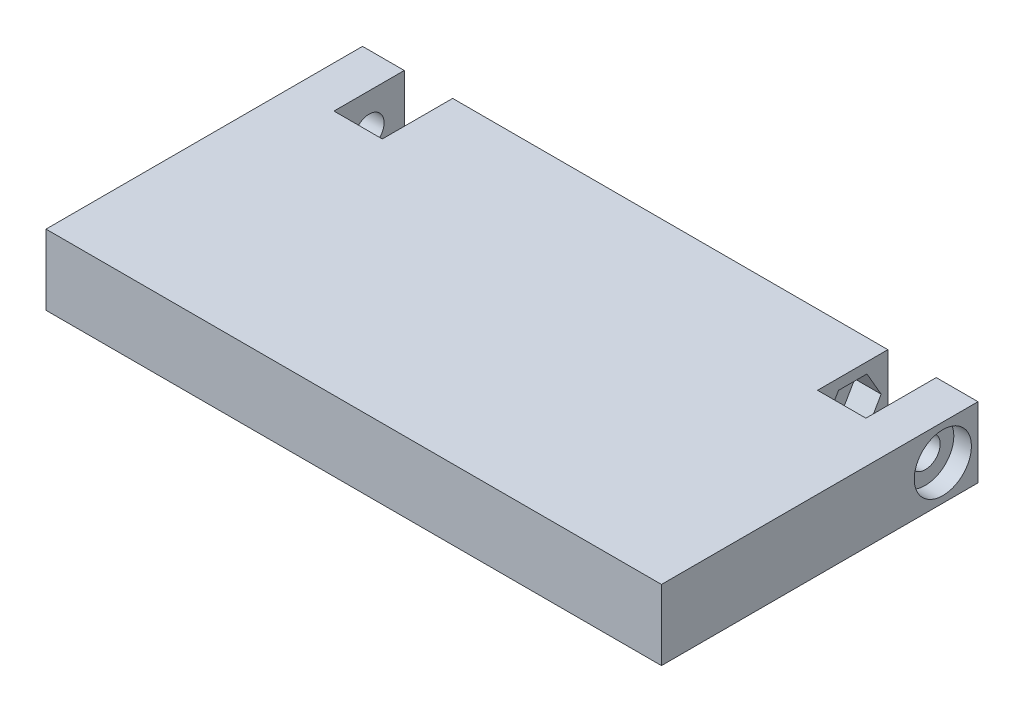
ISO-10303-21;
HEADER;
FILE_DESCRIPTION(('STEP AP214'),'2;1');
FILE_NAME('part.step','',(''),(''),'','','');
FILE_SCHEMA(('AUTOMOTIVE_DESIGN { 1 0 10303 214 1 1 1 1 }'));
ENDSEC;
DATA;
#1=APPLICATION_CONTEXT('core data for automotive mechanical design processes');
#2=APPLICATION_PROTOCOL_DEFINITION('international standard','automotive_design',2000,#1);
#3=PRODUCT_CONTEXT('',#1,'mechanical');
#4=PRODUCT('Part','Part','',(#3));
#5=PRODUCT_RELATED_PRODUCT_CATEGORY('part','',(#4));
#6=PRODUCT_DEFINITION_FORMATION('','',#4);
#7=PRODUCT_DEFINITION_CONTEXT('part definition',#1,'design');
#8=PRODUCT_DEFINITION('design','',#6,#7);
#9=PRODUCT_DEFINITION_SHAPE('','',#8);
#10=(LENGTH_UNIT() NAMED_UNIT(*) SI_UNIT(.MILLI.,.METRE.));
#11=(NAMED_UNIT(*) PLANE_ANGLE_UNIT() SI_UNIT($,.RADIAN.));
#12=(NAMED_UNIT(*) SI_UNIT($,.STERADIAN.) SOLID_ANGLE_UNIT());
#13=UNCERTAINTY_MEASURE_WITH_UNIT(LENGTH_MEASURE(1.E-05),#10,'distance_accuracy_value','');
#14=(GEOMETRIC_REPRESENTATION_CONTEXT(3) GLOBAL_UNCERTAINTY_ASSIGNED_CONTEXT((#13)) GLOBAL_UNIT_ASSIGNED_CONTEXT((#10,
#11,#12)) REPRESENTATION_CONTEXT('',''));
#15=CARTESIAN_POINT('',(0.,0.,0.));
#16=DIRECTION('',(0.,0.,1.));
#17=DIRECTION('',(1.,0.,0.));
#18=AXIS2_PLACEMENT_3D('',#15,#16,#17);
#19=CARTESIAN_POINT('',(-24.75,0.,-18.));
#20=DIRECTION('',(1.,0.,0.));
#21=DIRECTION('',(0.,0.,-1.));
#22=AXIS2_PLACEMENT_3D('',#19,#20,#21);
#23=PLANE('',#22);
#24=DIRECTION('',(0.,0.,-1.));
#25=VECTOR('',#24,1.);
#26=CARTESIAN_POINT('',(-24.75,8.,-18.));
#27=LINE('',#26,#25);
#28=CARTESIAN_POINT('',(-24.75,8.,-10.));
#29=VERTEX_POINT('',#28);
#30=CARTESIAN_POINT('',(-24.75,8.,-18.));
#31=VERTEX_POINT('',#30);
#32=EDGE_CURVE('E350',#29,#31,#27,.T.);
#33=ORIENTED_EDGE('',*,*,#32,.T.);
#34=DIRECTION('',(0.,1.,0.));
#35=VECTOR('',#34,1.);
#36=CARTESIAN_POINT('',(-24.75,0.,-18.));
#37=LINE('',#36,#35);
#38=CARTESIAN_POINT('',(-24.75,0.,-18.));
#39=VERTEX_POINT('',#38);
#40=EDGE_CURVE('E367',#39,#31,#37,.T.);
#41=ORIENTED_EDGE('',*,*,#40,.F.);
#42=DIRECTION('',(0.,0.,-1.));
#43=VECTOR('',#42,1.);
#44=CARTESIAN_POINT('',(-24.75,0.,-18.));
#45=LINE('',#44,#43);
#46=CARTESIAN_POINT('',(-24.75,0.,-10.));
#47=VERTEX_POINT('',#46);
#48=EDGE_CURVE('E353',#47,#39,#45,.T.);
#49=ORIENTED_EDGE('',*,*,#48,.F.);
#50=DIRECTION('',(0.,1.,0.));
#51=VECTOR('',#50,1.);
#52=CARTESIAN_POINT('',(-24.75,0.,-10.));
#53=LINE('',#52,#51);
#54=EDGE_CURVE('E370',#47,#29,#53,.T.);
#55=ORIENTED_EDGE('',*,*,#54,.T.);
#56=EDGE_LOOP('',(#33,#41,#49,#55));
#57=FACE_BOUND('',#56,.T.);
#58=DIRECTION('',(0.,0.866025403784438,0.5));
#59=VECTOR('',#58,1.);
#60=CARTESIAN_POINT('',(-24.75,4.,-17.2331615074619));
#61=LINE('',#60,#59);
#62=CARTESIAN_POINT('',(-24.75,4.,-17.2331615074619));
#63=VERTEX_POINT('',#62);
#64=CARTESIAN_POINT('',(-24.75,6.8,-15.616580753731));
#65=VERTEX_POINT('',#64);
#66=EDGE_CURVE('E50',#63,#65,#61,.T.);
#67=ORIENTED_EDGE('',*,*,#66,.T.);
#68=DIRECTION('',(0.,0.,1.));
#69=VECTOR('',#68,1.);
#70=CARTESIAN_POINT('',(-24.75,6.8,-15.616580753731));
#71=LINE('',#70,#69);
#72=CARTESIAN_POINT('',(-24.75,6.8,-12.383419246269));
#73=VERTEX_POINT('',#72);
#74=EDGE_CURVE('E217',#65,#73,#71,.T.);
#75=ORIENTED_EDGE('',*,*,#74,.T.);
#76=DIRECTION('',(0.,-0.866025403784438,0.5));
#77=VECTOR('',#76,1.);
#78=CARTESIAN_POINT('',(-24.75,6.8,-12.383419246269));
#79=LINE('',#78,#77);
#80=CARTESIAN_POINT('',(-24.75,4.,-10.7668384925381));
#81=VERTEX_POINT('',#80);
#82=EDGE_CURVE('E220',#73,#81,#79,.T.);
#83=ORIENTED_EDGE('',*,*,#82,.T.);
#84=DIRECTION('',(0.,-0.866025403784439,-0.5));
#85=VECTOR('',#84,1.);
#86=CARTESIAN_POINT('',(-24.75,4.,-10.7668384925381));
#87=LINE('',#86,#85);
#88=CARTESIAN_POINT('',(-24.75,1.2,-12.383419246269));
#89=VERTEX_POINT('',#88);
#90=EDGE_CURVE('E235',#81,#89,#87,.T.);
#91=ORIENTED_EDGE('',*,*,#90,.T.);
#92=DIRECTION('',(0.,0.,-1.));
#93=VECTOR('',#92,1.);
#94=CARTESIAN_POINT('',(-24.75,1.2,-12.383419246269));
#95=LINE('',#94,#93);
#96=CARTESIAN_POINT('',(-24.75,1.2,-15.616580753731));
#97=VERTEX_POINT('',#96);
#98=EDGE_CURVE('E232',#89,#97,#95,.T.);
#99=ORIENTED_EDGE('',*,*,#98,.T.);
#100=DIRECTION('',(0.,0.866025403784438,-0.500000000000001));
#101=VECTOR('',#100,1.);
#102=CARTESIAN_POINT('',(-24.75,1.2,-15.616580753731));
#103=LINE('',#102,#101);
#104=EDGE_CURVE('E230',#97,#63,#103,.T.);
#105=ORIENTED_EDGE('',*,*,#104,.T.);
#106=EDGE_LOOP('',(#67,#75,#83,#91,#99,#105));
#107=FACE_BOUND('',#106,.T.);
#108=ADVANCED_FACE('F35',(#57,#107),#23,.F.);
#109=CARTESIAN_POINT('',(-35.,8.,18.));
#110=DIRECTION('',(1.,0.,0.));
#111=DIRECTION('',(0.,0.,-1.));
#112=AXIS2_PLACEMENT_3D('',#109,#110,#111);
#113=PLANE('',#112);
#114=DIRECTION('',(0.,0.,1.));
#115=VECTOR('',#114,1.);
#116=CARTESIAN_POINT('',(-35.,0.,18.));
#117=LINE('',#116,#115);
#118=CARTESIAN_POINT('',(-35.,0.,-18.));
#119=VERTEX_POINT('',#118);
#120=CARTESIAN_POINT('',(-35.,0.,18.));
#121=VERTEX_POINT('',#120);
#122=EDGE_CURVE('E393',#119,#121,#117,.T.);
#123=ORIENTED_EDGE('',*,*,#122,.T.);
#124=DIRECTION('',(0.,-1.,0.));
#125=VECTOR('',#124,1.);
#126=CARTESIAN_POINT('',(-35.,8.,18.));
#127=LINE('',#126,#125);
#128=CARTESIAN_POINT('',(-35.,8.,18.));
#129=VERTEX_POINT('',#128);
#130=EDGE_CURVE('E399',#129,#121,#127,.T.);
#131=ORIENTED_EDGE('',*,*,#130,.F.);
#132=DIRECTION('',(0.,0.,1.));
#133=VECTOR('',#132,1.);
#134=CARTESIAN_POINT('',(-35.,8.,18.));
#135=LINE('',#134,#133);
#136=CARTESIAN_POINT('',(-35.,8.,-18.));
#137=VERTEX_POINT('',#136);
#138=EDGE_CURVE('E381',#137,#129,#135,.T.);
#139=ORIENTED_EDGE('',*,*,#138,.F.);
#140=DIRECTION('',(0.,-1.,0.));
#141=VECTOR('',#140,1.);
#142=CARTESIAN_POINT('',(-35.,8.,-18.));
#143=LINE('',#142,#141);
#144=EDGE_CURVE('E43',#137,#119,#143,.T.);
#145=ORIENTED_EDGE('',*,*,#144,.T.);
#146=EDGE_LOOP('',(#123,#131,#139,#145));
#147=FACE_BOUND('',#146,.T.);
#148=CARTESIAN_POINT('',(-35.,4.,-14.));
#149=DIRECTION('',(-1.,0.,0.));
#150=DIRECTION('',(0.,0.,1.));
#151=AXIS2_PLACEMENT_3D('',#148,#149,#150);
#152=CIRCLE('',#151,3.25);
#153=CARTESIAN_POINT('',(-35.,4.,-10.75));
#154=VERTEX_POINT('',#153);
#155=EDGE_CURVE('E242',#154,#154,#152,.T.);
#156=ORIENTED_EDGE('',*,*,#155,.F.);
#157=EDGE_LOOP('',(#156));
#158=FACE_BOUND('',#157,.T.);
#159=ADVANCED_FACE('F406',(#147,#158),#113,.F.);
#160=CARTESIAN_POINT('',(35.,8.,18.));
#161=DIRECTION('',(-1.,0.,0.));
#162=DIRECTION('',(0.,0.,1.));
#163=AXIS2_PLACEMENT_3D('',#160,#161,#162);
#164=PLANE('',#163);
#165=DIRECTION('',(0.,0.,-1.));
#166=VECTOR('',#165,1.);
#167=CARTESIAN_POINT('',(35.,0.,18.));
#168=LINE('',#167,#166);
#169=CARTESIAN_POINT('',(35.,0.,18.));
#170=VERTEX_POINT('',#169);
#171=CARTESIAN_POINT('',(35.,0.,-18.));
#172=VERTEX_POINT('',#171);
#173=EDGE_CURVE('E366',#170,#172,#168,.T.);
#174=ORIENTED_EDGE('',*,*,#173,.T.);
#175=DIRECTION('',(0.,-1.,0.));
#176=VECTOR('',#175,1.);
#177=CARTESIAN_POINT('',(35.,8.,-18.));
#178=LINE('',#177,#176);
#179=CARTESIAN_POINT('',(35.,8.,-18.));
#180=VERTEX_POINT('',#179);
#181=EDGE_CURVE('E11',#180,#172,#178,.T.);
#182=ORIENTED_EDGE('',*,*,#181,.F.);
#183=DIRECTION('',(0.,0.,-1.));
#184=VECTOR('',#183,1.);
#185=CARTESIAN_POINT('',(35.,8.,18.));
#186=LINE('',#185,#184);
#187=CARTESIAN_POINT('',(35.,8.,18.));
#188=VERTEX_POINT('',#187);
#189=EDGE_CURVE('E373',#188,#180,#186,.T.);
#190=ORIENTED_EDGE('',*,*,#189,.F.);
#191=DIRECTION('',(0.,-1.,0.));
#192=VECTOR('',#191,1.);
#193=CARTESIAN_POINT('',(35.,8.,18.));
#194=LINE('',#193,#192);
#195=EDGE_CURVE('E386',#188,#170,#194,.T.);
#196=ORIENTED_EDGE('',*,*,#195,.T.);
#197=EDGE_LOOP('',(#174,#182,#190,#196));
#198=FACE_BOUND('',#197,.T.);
#199=CARTESIAN_POINT('',(35.,4.,-14.));
#200=DIRECTION('',(1.,0.,0.));
#201=DIRECTION('',(0.,0.,-1.));
#202=AXIS2_PLACEMENT_3D('',#199,#200,#201);
#203=CIRCLE('',#202,3.25);
#204=CARTESIAN_POINT('',(35.,4.,-17.25));
#205=VERTEX_POINT('',#204);
#206=EDGE_CURVE('E298',#205,#205,#203,.T.);
#207=ORIENTED_EDGE('',*,*,#206,.F.);
#208=EDGE_LOOP('',(#207));
#209=FACE_BOUND('',#208,.T.);
#210=ADVANCED_FACE('F37',(#198,#209),#164,.F.);
#211=CARTESIAN_POINT('',(-35.,8.,-18.));
#212=DIRECTION('',(0.,0.,1.));
#213=DIRECTION('',(1.,0.,0.));
#214=AXIS2_PLACEMENT_3D('',#211,#212,#213);
#215=PLANE('',#214);
#216=DIRECTION('',(-1.,0.,0.));
#217=VECTOR('',#216,1.);
#218=CARTESIAN_POINT('',(-35.,0.,-18.));
#219=LINE('',#218,#217);
#220=CARTESIAN_POINT('',(30.25,0.,-18.));
#221=VERTEX_POINT('',#220);
#222=EDGE_CURVE('E390',#172,#221,#219,.T.);
#223=ORIENTED_EDGE('',*,*,#222,.T.);
#224=DIRECTION('',(0.,1.,0.));
#225=VECTOR('',#224,1.);
#226=CARTESIAN_POINT('',(30.25,0.,-18.));
#227=LINE('',#226,#225);
#228=CARTESIAN_POINT('',(30.25,8.,-18.));
#229=VERTEX_POINT('',#228);
#230=EDGE_CURVE('E337',#221,#229,#227,.T.);
#231=ORIENTED_EDGE('',*,*,#230,.T.);
#232=DIRECTION('',(-1.,0.,0.));
#233=VECTOR('',#232,1.);
#234=CARTESIAN_POINT('',(-35.,8.,-18.));
#235=LINE('',#234,#233);
#236=EDGE_CURVE('E378',#180,#229,#235,.T.);
#237=ORIENTED_EDGE('',*,*,#236,.F.);
#238=ORIENTED_EDGE('',*,*,#181,.T.);
#239=EDGE_LOOP('',(#223,#231,#237,#238));
#240=FACE_BOUND('',#239,.T.);
#241=ADVANCED_FACE('F646',(#240),#215,.F.);
#242=CARTESIAN_POINT('',(-30.25,8.,-18.));
#243=VERTEX_POINT('',#242);
#244=EDGE_CURVE('E376',#243,#137,#235,.T.);
#245=ORIENTED_EDGE('',*,*,#244,.F.);
#246=DIRECTION('',(0.,1.,0.));
#247=VECTOR('',#246,1.);
#248=CARTESIAN_POINT('',(-30.25,0.,-18.));
#249=LINE('',#248,#247);
#250=CARTESIAN_POINT('',(-30.25,0.,-18.));
#251=VERTEX_POINT('',#250);
#252=EDGE_CURVE('E364',#251,#243,#249,.T.);
#253=ORIENTED_EDGE('',*,*,#252,.F.);
#254=EDGE_CURVE('E389',#251,#119,#219,.T.);
#255=ORIENTED_EDGE('',*,*,#254,.T.);
#256=ORIENTED_EDGE('',*,*,#144,.F.);
#257=EDGE_LOOP('',(#245,#253,#255,#256));
#258=FACE_BOUND('',#257,.T.);
#259=ADVANCED_FACE('F442',(#258),#215,.F.);
#260=CARTESIAN_POINT('',(24.75,8.,-18.));
#261=VERTEX_POINT('',#260);
#262=EDGE_CURVE('E382',#261,#31,#235,.T.);
#263=ORIENTED_EDGE('',*,*,#262,.F.);
#264=DIRECTION('',(0.,1.,0.));
#265=VECTOR('',#264,1.);
#266=CARTESIAN_POINT('',(24.75,0.,-18.));
#267=LINE('',#266,#265);
#268=CARTESIAN_POINT('',(24.75,0.,-18.));
#269=VERTEX_POINT('',#268);
#270=EDGE_CURVE('E330',#269,#261,#267,.T.);
#271=ORIENTED_EDGE('',*,*,#270,.F.);
#272=EDGE_CURVE('E394',#269,#39,#219,.T.);
#273=ORIENTED_EDGE('',*,*,#272,.T.);
#274=ORIENTED_EDGE('',*,*,#40,.T.);
#275=EDGE_LOOP('',(#263,#271,#273,#274));
#276=FACE_BOUND('',#275,.T.);
#277=ADVANCED_FACE('F440',(#276),#215,.F.);
#278=CARTESIAN_POINT('',(-35.,8.,18.));
#279=DIRECTION('',(0.,0.,-1.));
#280=DIRECTION('',(-1.,0.,0.));
#281=AXIS2_PLACEMENT_3D('',#278,#279,#280);
#282=PLANE('',#281);
#283=DIRECTION('',(1.,0.,0.));
#284=VECTOR('',#283,1.);
#285=CARTESIAN_POINT('',(-35.,0.,18.));
#286=LINE('',#285,#284);
#287=EDGE_CURVE('E377',#121,#170,#286,.T.);
#288=ORIENTED_EDGE('',*,*,#287,.T.);
#289=ORIENTED_EDGE('',*,*,#195,.F.);
#290=DIRECTION('',(1.,0.,0.));
#291=VECTOR('',#290,1.);
#292=CARTESIAN_POINT('',(-35.,8.,18.));
#293=LINE('',#292,#291);
#294=EDGE_CURVE('E384',#129,#188,#293,.T.);
#295=ORIENTED_EDGE('',*,*,#294,.F.);
#296=ORIENTED_EDGE('',*,*,#130,.T.);
#297=EDGE_LOOP('',(#288,#289,#295,#296));
#298=FACE_BOUND('',#297,.T.);
#299=ADVANCED_FACE('F418',(#298),#282,.F.);
#300=CARTESIAN_POINT('',(0.,8.,0.));
#301=DIRECTION('',(0.,-1.,0.));
#302=DIRECTION('',(0.,0.,-1.));
#303=AXIS2_PLACEMENT_3D('',#300,#301,#302);
#304=PLANE('',#303);
#305=ORIENTED_EDGE('',*,*,#236,.T.);
#306=DIRECTION('',(0.,0.,-1.));
#307=VECTOR('',#306,1.);
#308=CARTESIAN_POINT('',(30.25,8.,-18.));
#309=LINE('',#308,#307);
#310=CARTESIAN_POINT('',(30.25,8.,-10.));
#311=VERTEX_POINT('',#310);
#312=EDGE_CURVE('E324',#311,#229,#309,.T.);
#313=ORIENTED_EDGE('',*,*,#312,.F.);
#314=DIRECTION('',(1.,0.,0.));
#315=VECTOR('',#314,1.);
#316=CARTESIAN_POINT('',(30.25,8.,-10.));
#317=LINE('',#316,#315);
#318=CARTESIAN_POINT('',(24.75,8.,-10.));
#319=VERTEX_POINT('',#318);
#320=EDGE_CURVE('E333',#319,#311,#317,.T.);
#321=ORIENTED_EDGE('',*,*,#320,.F.);
#322=DIRECTION('',(0.,0.,1.));
#323=VECTOR('',#322,1.);
#324=CARTESIAN_POINT('',(24.75,8.,-18.));
#325=LINE('',#324,#323);
#326=EDGE_CURVE('E319',#261,#319,#325,.T.);
#327=ORIENTED_EDGE('',*,*,#326,.F.);
#328=ORIENTED_EDGE('',*,*,#262,.T.);
#329=ORIENTED_EDGE('',*,*,#32,.F.);
#330=DIRECTION('',(1.,0.,0.));
#331=VECTOR('',#330,1.);
#332=CARTESIAN_POINT('',(-30.25,8.,-10.));
#333=LINE('',#332,#331);
#334=CARTESIAN_POINT('',(-30.25,8.,-10.));
#335=VERTEX_POINT('',#334);
#336=EDGE_CURVE('E359',#335,#29,#333,.T.);
#337=ORIENTED_EDGE('',*,*,#336,.F.);
#338=DIRECTION('',(0.,0.,1.));
#339=VECTOR('',#338,1.);
#340=CARTESIAN_POINT('',(-30.25,8.,-18.));
#341=LINE('',#340,#339);
#342=EDGE_CURVE('E340',#243,#335,#341,.T.);
#343=ORIENTED_EDGE('',*,*,#342,.F.);
#344=ORIENTED_EDGE('',*,*,#244,.T.);
#345=ORIENTED_EDGE('',*,*,#138,.T.);
#346=ORIENTED_EDGE('',*,*,#294,.T.);
#347=ORIENTED_EDGE('',*,*,#189,.T.);
#348=EDGE_LOOP('',(#305,#313,#321,#327,#328,#329,#337,#343,#344,#345,#346,#347));
#349=FACE_BOUND('',#348,.T.);
#350=ADVANCED_FACE('F425',(#349),#304,.F.);
#351=CARTESIAN_POINT('',(0.,0.,0.));
#352=DIRECTION('',(0.,-1.,0.));
#353=DIRECTION('',(0.,0.,-1.));
#354=AXIS2_PLACEMENT_3D('',#351,#352,#353);
#355=PLANE('',#354);
#356=DIRECTION('',(0.,0.,-1.));
#357=VECTOR('',#356,1.);
#358=CARTESIAN_POINT('',(30.25,0.,-18.));
#359=LINE('',#358,#357);
#360=CARTESIAN_POINT('',(30.25,0.,-10.));
#361=VERTEX_POINT('',#360);
#362=EDGE_CURVE('E327',#361,#221,#359,.T.);
#363=ORIENTED_EDGE('',*,*,#362,.T.);
#364=ORIENTED_EDGE('',*,*,#222,.F.);
#365=ORIENTED_EDGE('',*,*,#173,.F.);
#366=ORIENTED_EDGE('',*,*,#287,.F.);
#367=ORIENTED_EDGE('',*,*,#122,.F.);
#368=ORIENTED_EDGE('',*,*,#254,.F.);
#369=DIRECTION('',(0.,0.,1.));
#370=VECTOR('',#369,1.);
#371=CARTESIAN_POINT('',(-30.25,0.,-18.));
#372=LINE('',#371,#370);
#373=CARTESIAN_POINT('',(-30.25,0.,-10.));
#374=VERTEX_POINT('',#373);
#375=EDGE_CURVE('E346',#251,#374,#372,.T.);
#376=ORIENTED_EDGE('',*,*,#375,.T.);
#377=DIRECTION('',(1.,0.,0.));
#378=VECTOR('',#377,1.);
#379=CARTESIAN_POINT('',(-30.25,0.,-10.));
#380=LINE('',#379,#378);
#381=EDGE_CURVE('E349',#374,#47,#380,.T.);
#382=ORIENTED_EDGE('',*,*,#381,.T.);
#383=ORIENTED_EDGE('',*,*,#48,.T.);
#384=ORIENTED_EDGE('',*,*,#272,.F.);
#385=DIRECTION('',(0.,0.,1.));
#386=VECTOR('',#385,1.);
#387=CARTESIAN_POINT('',(24.75,0.,-18.));
#388=LINE('',#387,#386);
#389=CARTESIAN_POINT('',(24.75,0.,-10.));
#390=VERTEX_POINT('',#389);
#391=EDGE_CURVE('E320',#269,#390,#388,.T.);
#392=ORIENTED_EDGE('',*,*,#391,.T.);
#393=DIRECTION('',(1.,0.,0.));
#394=VECTOR('',#393,1.);
#395=CARTESIAN_POINT('',(30.25,0.,-10.));
#396=LINE('',#395,#394);
#397=EDGE_CURVE('E323',#390,#361,#396,.T.);
#398=ORIENTED_EDGE('',*,*,#397,.T.);
#399=EDGE_LOOP('',(#363,#364,#365,#366,#367,#368,#376,#382,#383,#384,#392,#398));
#400=FACE_BOUND('',#399,.T.);
#401=ADVANCED_FACE('F414',(#400),#355,.T.);
#402=CARTESIAN_POINT('',(-30.25,0.,-18.));
#403=DIRECTION('',(-1.,0.,0.));
#404=DIRECTION('',(0.,0.,1.));
#405=AXIS2_PLACEMENT_3D('',#402,#403,#404);
#406=PLANE('',#405);
#407=CARTESIAN_POINT('',(-30.25,4.,-14.));
#408=DIRECTION('',(-1.,0.,0.));
#409=DIRECTION('',(0.,0.,1.));
#410=AXIS2_PLACEMENT_3D('',#407,#408,#409);
#411=CIRCLE('',#410,1.7);
#412=CARTESIAN_POINT('',(-30.25,4.,-12.3));
#413=VERTEX_POINT('',#412);
#414=EDGE_CURVE('E258',#413,#413,#411,.T.);
#415=ORIENTED_EDGE('',*,*,#414,.T.);
#416=EDGE_LOOP('',(#415));
#417=FACE_BOUND('',#416,.T.);
#418=ORIENTED_EDGE('',*,*,#342,.T.);
#419=DIRECTION('',(0.,1.,0.));
#420=VECTOR('',#419,1.);
#421=CARTESIAN_POINT('',(-30.25,0.,-10.));
#422=LINE('',#421,#420);
#423=EDGE_CURVE('E356',#374,#335,#422,.T.);
#424=ORIENTED_EDGE('',*,*,#423,.F.);
#425=ORIENTED_EDGE('',*,*,#375,.F.);
#426=ORIENTED_EDGE('',*,*,#252,.T.);
#427=EDGE_LOOP('',(#418,#424,#425,#426));
#428=FACE_BOUND('',#427,.T.);
#429=ADVANCED_FACE('F444',(#417,#428),#406,.F.);
#430=CARTESIAN_POINT('',(-30.25,0.,-10.));
#431=DIRECTION('',(0.,0.,1.));
#432=DIRECTION('',(1.,0.,0.));
#433=AXIS2_PLACEMENT_3D('',#430,#431,#432);
#434=PLANE('',#433);
#435=ORIENTED_EDGE('',*,*,#336,.T.);
#436=ORIENTED_EDGE('',*,*,#54,.F.);
#437=ORIENTED_EDGE('',*,*,#381,.F.);
#438=ORIENTED_EDGE('',*,*,#423,.T.);
#439=EDGE_LOOP('',(#435,#436,#437,#438));
#440=FACE_BOUND('',#439,.T.);
#441=ADVANCED_FACE('F447',(#440),#434,.F.);
#442=CARTESIAN_POINT('',(30.25,0.,-18.));
#443=DIRECTION('',(1.,0.,0.));
#444=DIRECTION('',(0.,0.,-1.));
#445=AXIS2_PLACEMENT_3D('',#442,#443,#444);
#446=PLANE('',#445);
#447=CARTESIAN_POINT('',(30.25,4.,-14.));
#448=DIRECTION('',(1.,0.,0.));
#449=DIRECTION('',(0.,0.,-1.));
#450=AXIS2_PLACEMENT_3D('',#447,#448,#449);
#451=CIRCLE('',#450,1.7);
#452=CARTESIAN_POINT('',(30.25,4.,-15.7));
#453=VERTEX_POINT('',#452);
#454=EDGE_CURVE('E316',#453,#453,#451,.T.);
#455=ORIENTED_EDGE('',*,*,#454,.T.);
#456=EDGE_LOOP('',(#455));
#457=FACE_BOUND('',#456,.T.);
#458=ORIENTED_EDGE('',*,*,#312,.T.);
#459=ORIENTED_EDGE('',*,*,#230,.F.);
#460=ORIENTED_EDGE('',*,*,#362,.F.);
#461=DIRECTION('',(0.,1.,0.));
#462=VECTOR('',#461,1.);
#463=CARTESIAN_POINT('',(30.25,0.,-10.));
#464=LINE('',#463,#462);
#465=EDGE_CURVE('E341',#361,#311,#464,.T.);
#466=ORIENTED_EDGE('',*,*,#465,.T.);
#467=EDGE_LOOP('',(#458,#459,#460,#466));
#468=FACE_BOUND('',#467,.T.);
#469=ADVANCED_FACE('F449',(#457,#468),#446,.F.);
#470=CARTESIAN_POINT('',(30.25,0.,-10.));
#471=DIRECTION('',(0.,0.,1.));
#472=DIRECTION('',(1.,0.,0.));
#473=AXIS2_PLACEMENT_3D('',#470,#471,#472);
#474=PLANE('',#473);
#475=ORIENTED_EDGE('',*,*,#320,.T.);
#476=ORIENTED_EDGE('',*,*,#465,.F.);
#477=ORIENTED_EDGE('',*,*,#397,.F.);
#478=DIRECTION('',(0.,1.,0.));
#479=VECTOR('',#478,1.);
#480=CARTESIAN_POINT('',(24.75,0.,-10.));
#481=LINE('',#480,#479);
#482=EDGE_CURVE('E343',#390,#319,#481,.T.);
#483=ORIENTED_EDGE('',*,*,#482,.T.);
#484=EDGE_LOOP('',(#475,#476,#477,#483));
#485=FACE_BOUND('',#484,.T.);
#486=ADVANCED_FACE('F455',(#485),#474,.F.);
#487=CARTESIAN_POINT('',(24.75,0.,-18.));
#488=DIRECTION('',(-1.,0.,0.));
#489=DIRECTION('',(0.,0.,1.));
#490=AXIS2_PLACEMENT_3D('',#487,#488,#489);
#491=PLANE('',#490);
#492=DIRECTION('',(0.,0.,1.));
#493=VECTOR('',#492,1.);
#494=CARTESIAN_POINT('',(24.75,6.8,-15.616580753731));
#495=LINE('',#494,#493);
#496=CARTESIAN_POINT('',(24.75,6.8,-15.616580753731));
#497=VERTEX_POINT('',#496);
#498=CARTESIAN_POINT('',(24.75,6.8,-12.383419246269));
#499=VERTEX_POINT('',#498);
#500=EDGE_CURVE('E282',#497,#499,#495,.T.);
#501=ORIENTED_EDGE('',*,*,#500,.F.);
#502=DIRECTION('',(0.,0.866025403784438,0.5));
#503=VECTOR('',#502,1.);
#504=CARTESIAN_POINT('',(24.75,4.,-17.2331615074619));
#505=LINE('',#504,#503);
#506=CARTESIAN_POINT('',(24.75,4.,-17.2331615074619));
#507=VERTEX_POINT('',#506);
#508=EDGE_CURVE('E58',#507,#497,#505,.T.);
#509=ORIENTED_EDGE('',*,*,#508,.F.);
#510=DIRECTION('',(0.,0.866025403784438,-0.500000000000001));
#511=VECTOR('',#510,1.);
#512=CARTESIAN_POINT('',(24.75,1.2,-15.616580753731));
#513=LINE('',#512,#511);
#514=CARTESIAN_POINT('',(24.75,1.2,-15.616580753731));
#515=VERTEX_POINT('',#514);
#516=EDGE_CURVE('E265',#515,#507,#513,.T.);
#517=ORIENTED_EDGE('',*,*,#516,.F.);
#518=DIRECTION('',(0.,0.,-1.));
#519=VECTOR('',#518,1.);
#520=CARTESIAN_POINT('',(24.75,1.2,-12.383419246269));
#521=LINE('',#520,#519);
#522=CARTESIAN_POINT('',(24.75,1.2,-12.383419246269));
#523=VERTEX_POINT('',#522);
#524=EDGE_CURVE('E291',#523,#515,#521,.T.);
#525=ORIENTED_EDGE('',*,*,#524,.F.);
#526=DIRECTION('',(0.,-0.866025403784439,-0.5));
#527=VECTOR('',#526,1.);
#528=CARTESIAN_POINT('',(24.75,4.,-10.7668384925381));
#529=LINE('',#528,#527);
#530=CARTESIAN_POINT('',(24.75,4.,-10.7668384925381));
#531=VERTEX_POINT('',#530);
#532=EDGE_CURVE('E288',#531,#523,#529,.T.);
#533=ORIENTED_EDGE('',*,*,#532,.F.);
#534=DIRECTION('',(0.,-0.866025403784438,0.5));
#535=VECTOR('',#534,1.);
#536=CARTESIAN_POINT('',(24.75,6.8,-12.383419246269));
#537=LINE('',#536,#535);
#538=EDGE_CURVE('E285',#499,#531,#537,.T.);
#539=ORIENTED_EDGE('',*,*,#538,.F.);
#540=EDGE_LOOP('',(#501,#509,#517,#525,#533,#539));
#541=FACE_BOUND('',#540,.T.);
#542=ORIENTED_EDGE('',*,*,#326,.T.);
#543=ORIENTED_EDGE('',*,*,#482,.F.);
#544=ORIENTED_EDGE('',*,*,#391,.F.);
#545=ORIENTED_EDGE('',*,*,#270,.T.);
#546=EDGE_LOOP('',(#542,#543,#544,#545));
#547=FACE_BOUND('',#546,.T.);
#548=ADVANCED_FACE('F467',(#541,#547),#491,.F.);
#549=CARTESIAN_POINT('',(35.,4.,-14.));
#550=DIRECTION('',(1.,0.,0.));
#551=DIRECTION('',(0.,0.,-1.));
#552=AXIS2_PLACEMENT_3D('',#549,#550,#551);
#553=CYLINDRICAL_SURFACE('',#552,1.7);
#554=ORIENTED_EDGE('',*,*,#454,.F.);
#555=EDGE_LOOP('',(#554));
#556=FACE_BOUND('',#555,.T.);
#557=CARTESIAN_POINT('',(33.,4.,-14.));
#558=DIRECTION('',(1.,0.,0.));
#559=DIRECTION('',(0.,0.,-1.));
#560=AXIS2_PLACEMENT_3D('',#557,#558,#559);
#561=CIRCLE('',#560,1.7);
#562=CARTESIAN_POINT('',(33.,4.,-15.7));
#563=VERTEX_POINT('',#562);
#564=EDGE_CURVE('E313',#563,#563,#561,.T.);
#565=ORIENTED_EDGE('',*,*,#564,.T.);
#566=EDGE_LOOP('',(#565));
#567=FACE_BOUND('',#566,.T.);
#568=ADVANCED_FACE('F470',(#556,#567),#553,.F.);
#569=CARTESIAN_POINT('',(33.,5.7,-14.));
#570=DIRECTION('',(-1.,0.,0.));
#571=DIRECTION('',(0.,0.,1.));
#572=AXIS2_PLACEMENT_3D('',#569,#570,#571);
#573=PLANE('',#572);
#574=ORIENTED_EDGE('',*,*,#564,.F.);
#575=EDGE_LOOP('',(#574));
#576=FACE_BOUND('',#575,.T.);
#577=CARTESIAN_POINT('',(33.,4.,-14.));
#578=DIRECTION('',(1.,0.,0.));
#579=DIRECTION('',(0.,0.,-1.));
#580=AXIS2_PLACEMENT_3D('',#577,#578,#579);
#581=CIRCLE('',#580,3.25);
#582=CARTESIAN_POINT('',(33.,4.,-17.25));
#583=VERTEX_POINT('',#582);
#584=EDGE_CURVE('E310',#583,#583,#581,.T.);
#585=ORIENTED_EDGE('',*,*,#584,.T.);
#586=EDGE_LOOP('',(#585));
#587=FACE_BOUND('',#586,.T.);
#588=ADVANCED_FACE('F477',(#576,#587),#573,.F.);
#589=CARTESIAN_POINT('',(35.,4.,-14.));
#590=DIRECTION('',(1.,0.,0.));
#591=DIRECTION('',(0.,0.,-1.));
#592=AXIS2_PLACEMENT_3D('',#589,#590,#591);
#593=CYLINDRICAL_SURFACE('',#592,3.25);
#594=ORIENTED_EDGE('',*,*,#584,.F.);
#595=EDGE_LOOP('',(#594));
#596=FACE_BOUND('',#595,.T.);
#597=ORIENTED_EDGE('',*,*,#206,.T.);
#598=EDGE_LOOP('',(#597));
#599=FACE_BOUND('',#598,.T.);
#600=ADVANCED_FACE('F481',(#596,#599),#593,.F.);
#601=CARTESIAN_POINT('',(21.75,4.,-17.2331615074619));
#602=DIRECTION('',(0.,0.5,-0.866025403784438));
#603=DIRECTION('',(0.,0.866025403784439,0.5));
#604=AXIS2_PLACEMENT_3D('',#601,#602,#603);
#605=PLANE('',#604);
#606=ORIENTED_EDGE('',*,*,#508,.T.);
#607=DIRECTION('',(1.,0.,0.));
#608=VECTOR('',#607,1.);
#609=CARTESIAN_POINT('',(21.75,6.8,-15.616580753731));
#610=LINE('',#609,#608);
#611=CARTESIAN_POINT('',(21.75,6.8,-15.616580753731));
#612=VERTEX_POINT('',#611);
#613=EDGE_CURVE('E280',#612,#497,#610,.T.);
#614=ORIENTED_EDGE('',*,*,#613,.F.);
#615=DIRECTION('',(0.,0.866025403784438,0.5));
#616=VECTOR('',#615,1.);
#617=CARTESIAN_POINT('',(21.75,4.,-17.2331615074619));
#618=LINE('',#617,#616);
#619=CARTESIAN_POINT('',(21.75,4.,-17.2331615074619));
#620=VERTEX_POINT('',#619);
#621=EDGE_CURVE('E261',#620,#612,#618,.T.);
#622=ORIENTED_EDGE('',*,*,#621,.F.);
#623=DIRECTION('',(1.,0.,0.));
#624=VECTOR('',#623,1.);
#625=CARTESIAN_POINT('',(21.75,4.,-17.2331615074619));
#626=LINE('',#625,#624);
#627=EDGE_CURVE('E296',#620,#507,#626,.T.);
#628=ORIENTED_EDGE('',*,*,#627,.T.);
#629=EDGE_LOOP('',(#606,#614,#622,#628));
#630=FACE_BOUND('',#629,.T.);
#631=ADVANCED_FACE('F485',(#630),#605,.F.);
#632=CARTESIAN_POINT('',(21.75,1.2,-15.616580753731));
#633=DIRECTION('',(0.,-0.500000000000001,-0.866025403784438));
#634=DIRECTION('',(0.,0.866025403784438,-0.500000000000001));
#635=AXIS2_PLACEMENT_3D('',#632,#633,#634);
#636=PLANE('',#635);
#637=ORIENTED_EDGE('',*,*,#516,.T.);
#638=ORIENTED_EDGE('',*,*,#627,.F.);
#639=DIRECTION('',(0.,0.866025403784438,-0.500000000000001));
#640=VECTOR('',#639,1.);
#641=CARTESIAN_POINT('',(21.75,1.2,-15.616580753731));
#642=LINE('',#641,#640);
#643=CARTESIAN_POINT('',(21.75,1.2,-15.616580753731));
#644=VERTEX_POINT('',#643);
#645=EDGE_CURVE('E277',#644,#620,#642,.T.);
#646=ORIENTED_EDGE('',*,*,#645,.F.);
#647=DIRECTION('',(1.,0.,0.));
#648=VECTOR('',#647,1.);
#649=CARTESIAN_POINT('',(21.75,1.2,-15.616580753731));
#650=LINE('',#649,#648);
#651=EDGE_CURVE('E299',#644,#515,#650,.T.);
#652=ORIENTED_EDGE('',*,*,#651,.T.);
#653=EDGE_LOOP('',(#637,#638,#646,#652));
#654=FACE_BOUND('',#653,.T.);
#655=ADVANCED_FACE('F489',(#654),#636,.F.);
#656=CARTESIAN_POINT('',(21.75,1.2,-12.383419246269));
#657=DIRECTION('',(0.,-1.,0.));
#658=DIRECTION('',(0.,0.,-1.));
#659=AXIS2_PLACEMENT_3D('',#656,#657,#658);
#660=PLANE('',#659);
#661=ORIENTED_EDGE('',*,*,#524,.T.);
#662=ORIENTED_EDGE('',*,*,#651,.F.);
#663=DIRECTION('',(0.,0.,-1.));
#664=VECTOR('',#663,1.);
#665=CARTESIAN_POINT('',(21.75,1.2,-12.383419246269));
#666=LINE('',#665,#664);
#667=CARTESIAN_POINT('',(21.75,1.2,-12.383419246269));
#668=VERTEX_POINT('',#667);
#669=EDGE_CURVE('E274',#668,#644,#666,.T.);
#670=ORIENTED_EDGE('',*,*,#669,.F.);
#671=DIRECTION('',(1.,0.,0.));
#672=VECTOR('',#671,1.);
#673=CARTESIAN_POINT('',(21.75,1.2,-12.383419246269));
#674=LINE('',#673,#672);
#675=EDGE_CURVE('E301',#668,#523,#674,.T.);
#676=ORIENTED_EDGE('',*,*,#675,.T.);
#677=EDGE_LOOP('',(#661,#662,#670,#676));
#678=FACE_BOUND('',#677,.T.);
#679=ADVANCED_FACE('F502',(#678),#660,.F.);
#680=CARTESIAN_POINT('',(21.75,4.,-10.7668384925381));
#681=DIRECTION('',(0.,-0.5,0.866025403784439));
#682=DIRECTION('',(0.,-0.866025403784439,-0.5));
#683=AXIS2_PLACEMENT_3D('',#680,#681,#682);
#684=PLANE('',#683);
#685=ORIENTED_EDGE('',*,*,#532,.T.);
#686=ORIENTED_EDGE('',*,*,#675,.F.);
#687=DIRECTION('',(0.,-0.866025403784439,-0.5));
#688=VECTOR('',#687,1.);
#689=CARTESIAN_POINT('',(21.75,4.,-10.7668384925381));
#690=LINE('',#689,#688);
#691=CARTESIAN_POINT('',(21.75,4.,-10.7668384925381));
#692=VERTEX_POINT('',#691);
#693=EDGE_CURVE('E271',#692,#668,#690,.T.);
#694=ORIENTED_EDGE('',*,*,#693,.F.);
#695=DIRECTION('',(1.,0.,0.));
#696=VECTOR('',#695,1.);
#697=CARTESIAN_POINT('',(21.75,4.,-10.7668384925381));
#698=LINE('',#697,#696);
#699=EDGE_CURVE('E303',#692,#531,#698,.T.);
#700=ORIENTED_EDGE('',*,*,#699,.T.);
#701=EDGE_LOOP('',(#685,#686,#694,#700));
#702=FACE_BOUND('',#701,.T.);
#703=ADVANCED_FACE('F498',(#702),#684,.F.);
#704=CARTESIAN_POINT('',(21.75,6.8,-12.383419246269));
#705=DIRECTION('',(0.,0.5,0.866025403784439));
#706=DIRECTION('',(0.,-0.866025403784439,0.5));
#707=AXIS2_PLACEMENT_3D('',#704,#705,#706);
#708=PLANE('',#707);
#709=ORIENTED_EDGE('',*,*,#538,.T.);
#710=ORIENTED_EDGE('',*,*,#699,.F.);
#711=DIRECTION('',(0.,-0.866025403784438,0.5));
#712=VECTOR('',#711,1.);
#713=CARTESIAN_POINT('',(21.75,6.8,-12.383419246269));
#714=LINE('',#713,#712);
#715=CARTESIAN_POINT('',(21.75,6.8,-12.383419246269));
#716=VERTEX_POINT('',#715);
#717=EDGE_CURVE('E268',#716,#692,#714,.T.);
#718=ORIENTED_EDGE('',*,*,#717,.F.);
#719=DIRECTION('',(1.,0.,0.));
#720=VECTOR('',#719,1.);
#721=CARTESIAN_POINT('',(21.75,6.8,-12.383419246269));
#722=LINE('',#721,#720);
#723=EDGE_CURVE('E305',#716,#499,#722,.T.);
#724=ORIENTED_EDGE('',*,*,#723,.T.);
#725=EDGE_LOOP('',(#709,#710,#718,#724));
#726=FACE_BOUND('',#725,.T.);
#727=ADVANCED_FACE('F494',(#726),#708,.F.);
#728=CARTESIAN_POINT('',(21.75,6.8,-15.616580753731));
#729=DIRECTION('',(0.,1.,0.));
#730=DIRECTION('',(0.,0.,1.));
#731=AXIS2_PLACEMENT_3D('',#728,#729,#730);
#732=PLANE('',#731);
#733=ORIENTED_EDGE('',*,*,#500,.T.);
#734=ORIENTED_EDGE('',*,*,#723,.F.);
#735=DIRECTION('',(0.,0.,1.));
#736=VECTOR('',#735,1.);
#737=CARTESIAN_POINT('',(21.75,6.8,-15.616580753731));
#738=LINE('',#737,#736);
#739=EDGE_CURVE('E264',#612,#716,#738,.T.);
#740=ORIENTED_EDGE('',*,*,#739,.F.);
#741=ORIENTED_EDGE('',*,*,#613,.T.);
#742=EDGE_LOOP('',(#733,#734,#740,#741));
#743=FACE_BOUND('',#742,.T.);
#744=ADVANCED_FACE('F490',(#743),#732,.F.);
#745=CARTESIAN_POINT('',(21.75,0.,0.));
#746=DIRECTION('',(1.,0.,0.));
#747=DIRECTION('',(0.,0.,-1.));
#748=AXIS2_PLACEMENT_3D('',#745,#746,#747);
#749=PLANE('',#748);
#750=ORIENTED_EDGE('',*,*,#621,.T.);
#751=ORIENTED_EDGE('',*,*,#739,.T.);
#752=ORIENTED_EDGE('',*,*,#717,.T.);
#753=ORIENTED_EDGE('',*,*,#693,.T.);
#754=ORIENTED_EDGE('',*,*,#669,.T.);
#755=ORIENTED_EDGE('',*,*,#645,.T.);
#756=EDGE_LOOP('',(#750,#751,#752,#753,#754,#755));
#757=FACE_BOUND('',#756,.T.);
#758=ADVANCED_FACE('F493',(#757),#749,.T.);
#759=CARTESIAN_POINT('',(-35.,4.,-14.));
#760=DIRECTION('',(-1.,0.,0.));
#761=DIRECTION('',(0.,0.,1.));
#762=AXIS2_PLACEMENT_3D('',#759,#760,#761);
#763=CYLINDRICAL_SURFACE('',#762,1.7);
#764=ORIENTED_EDGE('',*,*,#414,.F.);
#765=EDGE_LOOP('',(#764));
#766=FACE_BOUND('',#765,.T.);
#767=CARTESIAN_POINT('',(-33.,4.,-14.));
#768=DIRECTION('',(-1.,0.,0.));
#769=DIRECTION('',(0.,0.,1.));
#770=AXIS2_PLACEMENT_3D('',#767,#768,#769);
#771=CIRCLE('',#770,1.7);
#772=CARTESIAN_POINT('',(-33.,4.,-12.3));
#773=VERTEX_POINT('',#772);
#774=EDGE_CURVE('E255',#773,#773,#771,.T.);
#775=ORIENTED_EDGE('',*,*,#774,.T.);
#776=EDGE_LOOP('',(#775));
#777=FACE_BOUND('',#776,.T.);
#778=ADVANCED_FACE('F512',(#766,#777),#763,.F.);
#779=CARTESIAN_POINT('',(-33.,5.7,-14.));
#780=DIRECTION('',(1.,0.,0.));
#781=DIRECTION('',(0.,0.,-1.));
#782=AXIS2_PLACEMENT_3D('',#779,#780,#781);
#783=PLANE('',#782);
#784=ORIENTED_EDGE('',*,*,#774,.F.);
#785=EDGE_LOOP('',(#784));
#786=FACE_BOUND('',#785,.T.);
#787=CARTESIAN_POINT('',(-33.,4.,-14.));
#788=DIRECTION('',(-1.,0.,0.));
#789=DIRECTION('',(0.,0.,1.));
#790=AXIS2_PLACEMENT_3D('',#787,#788,#789);
#791=CIRCLE('',#790,3.25);
#792=CARTESIAN_POINT('',(-33.,4.,-10.75));
#793=VERTEX_POINT('',#792);
#794=EDGE_CURVE('E252',#793,#793,#791,.T.);
#795=ORIENTED_EDGE('',*,*,#794,.T.);
#796=EDGE_LOOP('',(#795));
#797=FACE_BOUND('',#796,.T.);
#798=ADVANCED_FACE('F516',(#786,#797),#783,.F.);
#799=CARTESIAN_POINT('',(-35.,4.,-14.));
#800=DIRECTION('',(-1.,0.,0.));
#801=DIRECTION('',(0.,0.,1.));
#802=AXIS2_PLACEMENT_3D('',#799,#800,#801);
#803=CYLINDRICAL_SURFACE('',#802,3.25);
#804=ORIENTED_EDGE('',*,*,#794,.F.);
#805=EDGE_LOOP('',(#804));
#806=FACE_BOUND('',#805,.T.);
#807=ORIENTED_EDGE('',*,*,#155,.T.);
#808=EDGE_LOOP('',(#807));
#809=FACE_BOUND('',#808,.T.);
#810=ADVANCED_FACE('F520',(#806,#809),#803,.F.);
#811=CARTESIAN_POINT('',(-21.75,4.,-17.2331615074619));
#812=DIRECTION('',(0.,-0.5,0.866025403784438));
#813=DIRECTION('',(0.,-0.866025403784439,-0.5));
#814=AXIS2_PLACEMENT_3D('',#811,#812,#813);
#815=PLANE('',#814);
#816=ORIENTED_EDGE('',*,*,#66,.F.);
#817=DIRECTION('',(-1.,0.,0.));
#818=VECTOR('',#817,1.);
#819=CARTESIAN_POINT('',(-21.75,4.,-17.2331615074619));
#820=LINE('',#819,#818);
#821=CARTESIAN_POINT('',(-21.75,4.,-17.2331615074619));
#822=VERTEX_POINT('',#821);
#823=EDGE_CURVE('E201',#822,#63,#820,.T.);
#824=ORIENTED_EDGE('',*,*,#823,.F.);
#825=DIRECTION('',(0.,0.866025403784438,0.5));
#826=VECTOR('',#825,1.);
#827=CARTESIAN_POINT('',(-21.75,4.,-17.2331615074619));
#828=LINE('',#827,#826);
#829=CARTESIAN_POINT('',(-21.75,6.8,-15.616580753731));
#830=VERTEX_POINT('',#829);
#831=EDGE_CURVE('E208',#822,#830,#828,.T.);
#832=ORIENTED_EDGE('',*,*,#831,.T.);
#833=DIRECTION('',(-1.,0.,0.));
#834=VECTOR('',#833,1.);
#835=CARTESIAN_POINT('',(-21.75,6.8,-15.616580753731));
#836=LINE('',#835,#834);
#837=EDGE_CURVE('E240',#830,#65,#836,.T.);
#838=ORIENTED_EDGE('',*,*,#837,.T.);
#839=EDGE_LOOP('',(#816,#824,#832,#838));
#840=FACE_BOUND('',#839,.T.);
#841=ADVANCED_FACE('F211',(#840),#815,.T.);
#842=CARTESIAN_POINT('',(-21.75,6.8,-15.616580753731));
#843=DIRECTION('',(0.,-1.,0.));
#844=DIRECTION('',(0.,0.,-1.));
#845=AXIS2_PLACEMENT_3D('',#842,#843,#844);
#846=PLANE('',#845);
#847=ORIENTED_EDGE('',*,*,#74,.F.);
#848=ORIENTED_EDGE('',*,*,#837,.F.);
#849=DIRECTION('',(0.,0.,1.));
#850=VECTOR('',#849,1.);
#851=CARTESIAN_POINT('',(-21.75,6.8,-15.616580753731));
#852=LINE('',#851,#850);
#853=CARTESIAN_POINT('',(-21.75,6.8,-12.383419246269));
#854=VERTEX_POINT('',#853);
#855=EDGE_CURVE('E213',#830,#854,#852,.T.);
#856=ORIENTED_EDGE('',*,*,#855,.T.);
#857=DIRECTION('',(-1.,0.,0.));
#858=VECTOR('',#857,1.);
#859=CARTESIAN_POINT('',(-21.75,6.8,-12.383419246269));
#860=LINE('',#859,#858);
#861=EDGE_CURVE('E243',#854,#73,#860,.T.);
#862=ORIENTED_EDGE('',*,*,#861,.T.);
#863=EDGE_LOOP('',(#847,#848,#856,#862));
#864=FACE_BOUND('',#863,.T.);
#865=ADVANCED_FACE('F527',(#864),#846,.T.);
#866=CARTESIAN_POINT('',(-21.75,6.8,-12.383419246269));
#867=DIRECTION('',(0.,-0.5,-0.866025403784439));
#868=DIRECTION('',(0.,0.866025403784439,-0.5));
#869=AXIS2_PLACEMENT_3D('',#866,#867,#868);
#870=PLANE('',#869);
#871=ORIENTED_EDGE('',*,*,#82,.F.);
#872=ORIENTED_EDGE('',*,*,#861,.F.);
#873=DIRECTION('',(0.,-0.866025403784438,0.5));
#874=VECTOR('',#873,1.);
#875=CARTESIAN_POINT('',(-21.75,6.8,-12.383419246269));
#876=LINE('',#875,#874);
#877=CARTESIAN_POINT('',(-21.75,4.,-10.7668384925381));
#878=VERTEX_POINT('',#877);
#879=EDGE_CURVE('E226',#854,#878,#876,.T.);
#880=ORIENTED_EDGE('',*,*,#879,.T.);
#881=DIRECTION('',(-1.,0.,0.));
#882=VECTOR('',#881,1.);
#883=CARTESIAN_POINT('',(-21.75,4.,-10.7668384925381));
#884=LINE('',#883,#882);
#885=EDGE_CURVE('E245',#878,#81,#884,.T.);
#886=ORIENTED_EDGE('',*,*,#885,.T.);
#887=EDGE_LOOP('',(#871,#872,#880,#886));
#888=FACE_BOUND('',#887,.T.);
#889=ADVANCED_FACE('F537',(#888),#870,.T.);
#890=CARTESIAN_POINT('',(-21.75,4.,-10.7668384925381));
#891=DIRECTION('',(0.,0.5,-0.866025403784439));
#892=DIRECTION('',(0.,0.866025403784439,0.5));
#893=AXIS2_PLACEMENT_3D('',#890,#891,#892);
#894=PLANE('',#893);
#895=ORIENTED_EDGE('',*,*,#90,.F.);
#896=ORIENTED_EDGE('',*,*,#885,.F.);
#897=DIRECTION('',(0.,-0.866025403784439,-0.5));
#898=VECTOR('',#897,1.);
#899=CARTESIAN_POINT('',(-21.75,4.,-10.7668384925381));
#900=LINE('',#899,#898);
#901=CARTESIAN_POINT('',(-21.75,1.2,-12.383419246269));
#902=VERTEX_POINT('',#901);
#903=EDGE_CURVE('E224',#878,#902,#900,.T.);
#904=ORIENTED_EDGE('',*,*,#903,.T.);
#905=DIRECTION('',(-1.,0.,0.));
#906=VECTOR('',#905,1.);
#907=CARTESIAN_POINT('',(-21.75,1.2,-12.383419246269));
#908=LINE('',#907,#906);
#909=EDGE_CURVE('E247',#902,#89,#908,.T.);
#910=ORIENTED_EDGE('',*,*,#909,.T.);
#911=EDGE_LOOP('',(#895,#896,#904,#910));
#912=FACE_BOUND('',#911,.T.);
#913=ADVANCED_FACE('F533',(#912),#894,.T.);
#914=CARTESIAN_POINT('',(-21.75,1.2,-12.383419246269));
#915=DIRECTION('',(0.,1.,0.));
#916=DIRECTION('',(0.,0.,1.));
#917=AXIS2_PLACEMENT_3D('',#914,#915,#916);
#918=PLANE('',#917);
#919=ORIENTED_EDGE('',*,*,#98,.F.);
#920=ORIENTED_EDGE('',*,*,#909,.F.);
#921=DIRECTION('',(0.,0.,-1.));
#922=VECTOR('',#921,1.);
#923=CARTESIAN_POINT('',(-21.75,1.2,-12.383419246269));
#924=LINE('',#923,#922);
#925=CARTESIAN_POINT('',(-21.75,1.2,-15.616580753731));
#926=VERTEX_POINT('',#925);
#927=EDGE_CURVE('E207',#902,#926,#924,.T.);
#928=ORIENTED_EDGE('',*,*,#927,.T.);
#929=DIRECTION('',(-1.,0.,0.));
#930=VECTOR('',#929,1.);
#931=CARTESIAN_POINT('',(-21.75,1.2,-15.616580753731));
#932=LINE('',#931,#930);
#933=EDGE_CURVE('E203',#926,#97,#932,.T.);
#934=ORIENTED_EDGE('',*,*,#933,.T.);
#935=EDGE_LOOP('',(#919,#920,#928,#934));
#936=FACE_BOUND('',#935,.T.);
#937=ADVANCED_FACE('F530',(#936),#918,.T.);
#938=CARTESIAN_POINT('',(-21.75,1.2,-15.616580753731));
#939=DIRECTION('',(0.,0.500000000000001,0.866025403784438));
#940=DIRECTION('',(0.,-0.866025403784438,0.500000000000001));
#941=AXIS2_PLACEMENT_3D('',#938,#939,#940);
#942=PLANE('',#941);
#943=ORIENTED_EDGE('',*,*,#104,.F.);
#944=ORIENTED_EDGE('',*,*,#933,.F.);
#945=DIRECTION('',(0.,0.866025403784438,-0.500000000000001));
#946=VECTOR('',#945,1.);
#947=CARTESIAN_POINT('',(-21.75,1.2,-15.616580753731));
#948=LINE('',#947,#946);
#949=EDGE_CURVE('E198',#926,#822,#948,.T.);
#950=ORIENTED_EDGE('',*,*,#949,.T.);
#951=ORIENTED_EDGE('',*,*,#823,.T.);
#952=EDGE_LOOP('',(#943,#944,#950,#951));
#953=FACE_BOUND('',#952,.T.);
#954=ADVANCED_FACE('F200',(#953),#942,.T.);
#955=CARTESIAN_POINT('',(-21.75,0.,0.));
#956=DIRECTION('',(-1.,0.,0.));
#957=DIRECTION('',(0.,0.,-1.));
#958=AXIS2_PLACEMENT_3D('',#955,#956,#957);
#959=PLANE('',#958);
#960=ORIENTED_EDGE('',*,*,#831,.F.);
#961=ORIENTED_EDGE('',*,*,#949,.F.);
#962=ORIENTED_EDGE('',*,*,#927,.F.);
#963=ORIENTED_EDGE('',*,*,#903,.F.);
#964=ORIENTED_EDGE('',*,*,#879,.F.);
#965=ORIENTED_EDGE('',*,*,#855,.F.);
#966=EDGE_LOOP('',(#960,#961,#962,#963,#964,#965));
#967=FACE_BOUND('',#966,.T.);
#968=ADVANCED_FACE('F215',(#967),#959,.T.);
#969=CLOSED_SHELL('',(#108,#159,#210,#241,#259,#277,#299,#350,#401,#429,#441,#469,#486,#548,
#568,#588,#600,#631,#655,#679,#703,#727,#744,#758,#778,#798,#810,#841,#865,#889,#913,#937,#954,#968));
#970=MANIFOLD_SOLID_BREP('B2',#969);
#971=ADVANCED_BREP_SHAPE_REPRESENTATION('',(#18,#970),#14);
#972=SHAPE_DEFINITION_REPRESENTATION(#9,#971);
ENDSEC;
END-ISO-10303-21;
